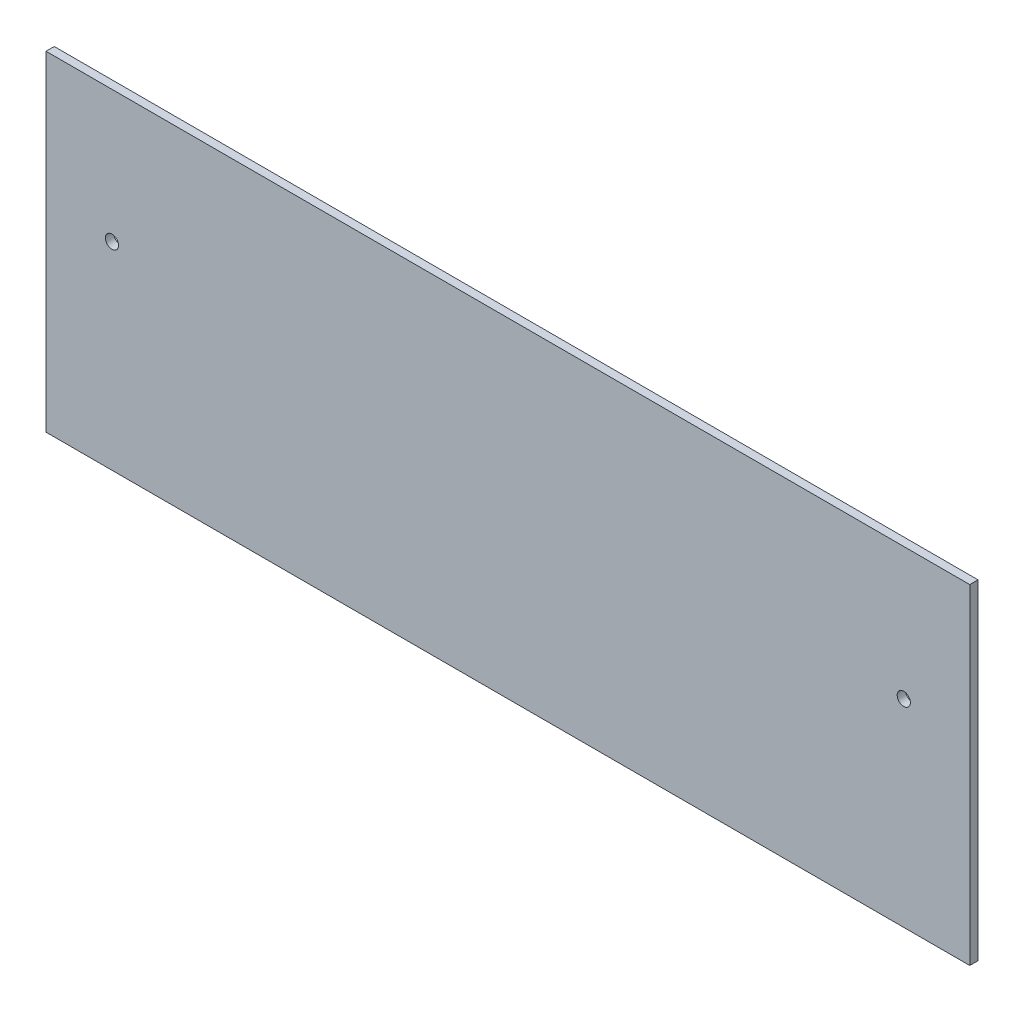
ISO-10303-21;
HEADER;
FILE_DESCRIPTION(('STEP AP214'),'2;1');
FILE_NAME('part.step','',(''),(''),'','','');
FILE_SCHEMA(('AUTOMOTIVE_DESIGN { 1 0 10303 214 1 1 1 1 }'));
ENDSEC;
DATA;
#1=APPLICATION_CONTEXT('core data for automotive mechanical design processes');
#2=APPLICATION_PROTOCOL_DEFINITION('international standard','automotive_design',2000,#1);
#3=PRODUCT_CONTEXT('',#1,'mechanical');
#4=PRODUCT('Part','Part','',(#3));
#5=PRODUCT_RELATED_PRODUCT_CATEGORY('part','',(#4));
#6=PRODUCT_DEFINITION_FORMATION('','',#4);
#7=PRODUCT_DEFINITION_CONTEXT('part definition',#1,'design');
#8=PRODUCT_DEFINITION('design','',#6,#7);
#9=PRODUCT_DEFINITION_SHAPE('','',#8);
#10=(LENGTH_UNIT() NAMED_UNIT(*) SI_UNIT(.MILLI.,.METRE.));
#11=(NAMED_UNIT(*) PLANE_ANGLE_UNIT() SI_UNIT($,.RADIAN.));
#12=(NAMED_UNIT(*) SI_UNIT($,.STERADIAN.) SOLID_ANGLE_UNIT());
#13=UNCERTAINTY_MEASURE_WITH_UNIT(LENGTH_MEASURE(1.E-05),#10,'distance_accuracy_value','');
#14=(GEOMETRIC_REPRESENTATION_CONTEXT(3) GLOBAL_UNCERTAINTY_ASSIGNED_CONTEXT((#13)) GLOBAL_UNIT_ASSIGNED_CONTEXT((#10,
#11,#12)) REPRESENTATION_CONTEXT('',''));
#15=CARTESIAN_POINT('',(0.,0.,0.));
#16=DIRECTION('',(0.,0.,1.));
#17=DIRECTION('',(1.,0.,0.));
#18=AXIS2_PLACEMENT_3D('',#15,#16,#17);
#19=CARTESIAN_POINT('',(0.,0.,2.5));
#20=DIRECTION('',(1.,0.,0.));
#21=DIRECTION('',(0.,0.,-1.));
#22=AXIS2_PLACEMENT_3D('',#19,#20,#21);
#23=PLANE('',#22);
#24=DIRECTION('',(0.,-1.,0.));
#25=VECTOR('',#24,1.);
#26=CARTESIAN_POINT('',(0.,0.,0.));
#27=LINE('',#26,#25);
#28=CARTESIAN_POINT('',(0.,100.,0.));
#29=VERTEX_POINT('',#28);
#30=CARTESIAN_POINT('',(0.,0.,0.));
#31=VERTEX_POINT('',#30);
#32=EDGE_CURVE('E100',#29,#31,#27,.T.);
#33=ORIENTED_EDGE('',*,*,#32,.T.);
#34=DIRECTION('',(0.,0.,-1.));
#35=VECTOR('',#34,1.);
#36=CARTESIAN_POINT('',(0.,0.,2.5));
#37=LINE('',#36,#35);
#38=CARTESIAN_POINT('',(0.,0.,2.5));
#39=VERTEX_POINT('',#38);
#40=EDGE_CURVE('E11',#39,#31,#37,.T.);
#41=ORIENTED_EDGE('',*,*,#40,.F.);
#42=DIRECTION('',(0.,-1.,0.));
#43=VECTOR('',#42,1.);
#44=CARTESIAN_POINT('',(0.,0.,2.5));
#45=LINE('',#44,#43);
#46=CARTESIAN_POINT('',(0.,100.,2.5));
#47=VERTEX_POINT('',#46);
#48=EDGE_CURVE('E88',#47,#39,#45,.T.);
#49=ORIENTED_EDGE('',*,*,#48,.F.);
#50=DIRECTION('',(0.,0.,-1.));
#51=VECTOR('',#50,1.);
#52=CARTESIAN_POINT('',(0.,100.,2.5));
#53=LINE('',#52,#51);
#54=EDGE_CURVE('E96',#47,#29,#53,.T.);
#55=ORIENTED_EDGE('',*,*,#54,.T.);
#56=EDGE_LOOP('',(#33,#41,#49,#55));
#57=FACE_BOUND('',#56,.T.);
#58=ADVANCED_FACE('F37',(#57),#23,.F.);
#59=CARTESIAN_POINT('',(0.,0.,2.5));
#60=DIRECTION('',(0.,1.,0.));
#61=DIRECTION('',(0.,0.,1.));
#62=AXIS2_PLACEMENT_3D('',#59,#60,#61);
#63=PLANE('',#62);
#64=DIRECTION('',(1.,0.,0.));
#65=VECTOR('',#64,1.);
#66=CARTESIAN_POINT('',(0.,0.,0.));
#67=LINE('',#66,#65);
#68=CARTESIAN_POINT('',(280.,0.,0.));
#69=VERTEX_POINT('',#68);
#70=EDGE_CURVE('E92',#31,#69,#67,.T.);
#71=ORIENTED_EDGE('',*,*,#70,.T.);
#72=DIRECTION('',(0.,0.,-1.));
#73=VECTOR('',#72,1.);
#74=CARTESIAN_POINT('',(280.,0.,2.5));
#75=LINE('',#74,#73);
#76=CARTESIAN_POINT('',(280.,0.,2.5));
#77=VERTEX_POINT('',#76);
#78=EDGE_CURVE('E45',#77,#69,#75,.T.);
#79=ORIENTED_EDGE('',*,*,#78,.F.);
#80=DIRECTION('',(1.,0.,0.));
#81=VECTOR('',#80,1.);
#82=CARTESIAN_POINT('',(0.,0.,2.5));
#83=LINE('',#82,#81);
#84=EDGE_CURVE('E83',#39,#77,#83,.T.);
#85=ORIENTED_EDGE('',*,*,#84,.F.);
#86=ORIENTED_EDGE('',*,*,#40,.T.);
#87=EDGE_LOOP('',(#71,#79,#85,#86));
#88=FACE_BOUND('',#87,.T.);
#89=ADVANCED_FACE('F91',(#88),#63,.F.);
#90=CARTESIAN_POINT('',(280.,0.,2.5));
#91=DIRECTION('',(-1.,0.,0.));
#92=DIRECTION('',(0.,0.,1.));
#93=AXIS2_PLACEMENT_3D('',#90,#91,#92);
#94=PLANE('',#93);
#95=DIRECTION('',(0.,1.,0.));
#96=VECTOR('',#95,1.);
#97=CARTESIAN_POINT('',(280.,0.,0.));
#98=LINE('',#97,#96);
#99=CARTESIAN_POINT('',(280.,100.,0.));
#100=VERTEX_POINT('',#99);
#101=EDGE_CURVE('E70',#69,#100,#98,.T.);
#102=ORIENTED_EDGE('',*,*,#101,.T.);
#103=DIRECTION('',(0.,0.,-1.));
#104=VECTOR('',#103,1.);
#105=CARTESIAN_POINT('',(280.,100.,2.5));
#106=LINE('',#105,#104);
#107=CARTESIAN_POINT('',(280.,100.,2.5));
#108=VERTEX_POINT('',#107);
#109=EDGE_CURVE('E93',#108,#100,#106,.T.);
#110=ORIENTED_EDGE('',*,*,#109,.F.);
#111=DIRECTION('',(0.,1.,0.));
#112=VECTOR('',#111,1.);
#113=CARTESIAN_POINT('',(280.,0.,2.5));
#114=LINE('',#113,#112);
#115=EDGE_CURVE('E86',#77,#108,#114,.T.);
#116=ORIENTED_EDGE('',*,*,#115,.F.);
#117=ORIENTED_EDGE('',*,*,#78,.T.);
#118=EDGE_LOOP('',(#102,#110,#116,#117));
#119=FACE_BOUND('',#118,.T.);
#120=ADVANCED_FACE('F94',(#119),#94,.F.);
#121=CARTESIAN_POINT('',(0.,100.,2.5));
#122=DIRECTION('',(0.,-1.,0.));
#123=DIRECTION('',(0.,0.,-1.));
#124=AXIS2_PLACEMENT_3D('',#121,#122,#123);
#125=PLANE('',#124);
#126=DIRECTION('',(-1.,0.,0.));
#127=VECTOR('',#126,1.);
#128=CARTESIAN_POINT('',(0.,100.,0.));
#129=LINE('',#128,#127);
#130=EDGE_CURVE('E76',#100,#29,#129,.T.);
#131=ORIENTED_EDGE('',*,*,#130,.T.);
#132=ORIENTED_EDGE('',*,*,#54,.F.);
#133=DIRECTION('',(-1.,0.,0.));
#134=VECTOR('',#133,1.);
#135=CARTESIAN_POINT('',(0.,100.,2.5));
#136=LINE('',#135,#134);
#137=EDGE_CURVE('E53',#108,#47,#136,.T.);
#138=ORIENTED_EDGE('',*,*,#137,.F.);
#139=ORIENTED_EDGE('',*,*,#109,.T.);
#140=EDGE_LOOP('',(#131,#132,#138,#139));
#141=FACE_BOUND('',#140,.T.);
#142=ADVANCED_FACE('F108',(#141),#125,.F.);
#143=CARTESIAN_POINT('',(0.,0.,2.5));
#144=DIRECTION('',(0.,0.,-1.));
#145=DIRECTION('',(-1.,0.,0.));
#146=AXIS2_PLACEMENT_3D('',#143,#144,#145);
#147=PLANE('',#146);
#148=CARTESIAN_POINT('',(20.,60.,2.5));
#149=DIRECTION('',(0.,0.,-1.));
#150=DIRECTION('',(-1.,0.,0.));
#151=AXIS2_PLACEMENT_3D('',#148,#149,#150);
#152=CIRCLE('',#151,2.);
#153=CARTESIAN_POINT('',(18.,60.,2.5));
#154=VERTEX_POINT('',#153);
#155=EDGE_CURVE('E103',#154,#154,#152,.T.);
#156=ORIENTED_EDGE('',*,*,#155,.T.);
#157=EDGE_LOOP('',(#156));
#158=FACE_BOUND('',#157,.T.);
#159=CARTESIAN_POINT('',(260.,60.,2.5));
#160=DIRECTION('',(0.,0.,-1.));
#161=DIRECTION('',(-1.,0.,0.));
#162=AXIS2_PLACEMENT_3D('',#159,#160,#161);
#163=CIRCLE('',#162,2.);
#164=CARTESIAN_POINT('',(258.,60.,2.5));
#165=VERTEX_POINT('',#164);
#166=EDGE_CURVE('E116',#165,#165,#163,.T.);
#167=ORIENTED_EDGE('',*,*,#166,.T.);
#168=EDGE_LOOP('',(#167));
#169=FACE_BOUND('',#168,.T.);
#170=ORIENTED_EDGE('',*,*,#48,.T.);
#171=ORIENTED_EDGE('',*,*,#84,.T.);
#172=ORIENTED_EDGE('',*,*,#115,.T.);
#173=ORIENTED_EDGE('',*,*,#137,.T.);
#174=EDGE_LOOP('',(#170,#171,#172,#173));
#175=FACE_BOUND('',#174,.T.);
#176=ADVANCED_FACE('F84',(#158,#169,#175),#147,.F.);
#177=CARTESIAN_POINT('',(0.,0.,0.));
#178=DIRECTION('',(0.,0.,-1.));
#179=DIRECTION('',(-1.,0.,0.));
#180=AXIS2_PLACEMENT_3D('',#177,#178,#179);
#181=PLANE('',#180);
#182=CARTESIAN_POINT('',(20.,60.,0.));
#183=DIRECTION('',(0.,0.,-1.));
#184=DIRECTION('',(-1.,0.,0.));
#185=AXIS2_PLACEMENT_3D('',#182,#183,#184);
#186=CIRCLE('',#185,2.);
#187=CARTESIAN_POINT('',(18.,60.,0.));
#188=VERTEX_POINT('',#187);
#189=EDGE_CURVE('E119',#188,#188,#186,.T.);
#190=ORIENTED_EDGE('',*,*,#189,.F.);
#191=EDGE_LOOP('',(#190));
#192=FACE_BOUND('',#191,.T.);
#193=CARTESIAN_POINT('',(260.,60.,0.));
#194=DIRECTION('',(0.,0.,-1.));
#195=DIRECTION('',(-1.,0.,0.));
#196=AXIS2_PLACEMENT_3D('',#193,#194,#195);
#197=CIRCLE('',#196,2.);
#198=CARTESIAN_POINT('',(258.,60.,0.));
#199=VERTEX_POINT('',#198);
#200=EDGE_CURVE('E120',#199,#199,#197,.T.);
#201=ORIENTED_EDGE('',*,*,#200,.F.);
#202=EDGE_LOOP('',(#201));
#203=FACE_BOUND('',#202,.T.);
#204=ORIENTED_EDGE('',*,*,#32,.F.);
#205=ORIENTED_EDGE('',*,*,#130,.F.);
#206=ORIENTED_EDGE('',*,*,#101,.F.);
#207=ORIENTED_EDGE('',*,*,#70,.F.);
#208=EDGE_LOOP('',(#204,#205,#206,#207));
#209=FACE_BOUND('',#208,.T.);
#210=ADVANCED_FACE('F111',(#192,#203,#209),#181,.T.);
#211=CARTESIAN_POINT('',(260.,60.,10.));
#212=DIRECTION('',(0.,0.,-1.));
#213=DIRECTION('',(-1.,0.,0.));
#214=AXIS2_PLACEMENT_3D('',#211,#212,#213);
#215=CYLINDRICAL_SURFACE('',#214,2.);
#216=ORIENTED_EDGE('',*,*,#200,.T.);
#217=EDGE_LOOP('',(#216));
#218=FACE_BOUND('',#217,.T.);
#219=ORIENTED_EDGE('',*,*,#166,.F.);
#220=EDGE_LOOP('',(#219));
#221=FACE_BOUND('',#220,.T.);
#222=ADVANCED_FACE('F131',(#218,#221),#215,.F.);
#223=CARTESIAN_POINT('',(20.,60.,10.));
#224=DIRECTION('',(0.,0.,-1.));
#225=DIRECTION('',(-1.,0.,0.));
#226=AXIS2_PLACEMENT_3D('',#223,#224,#225);
#227=CYLINDRICAL_SURFACE('',#226,2.);
#228=ORIENTED_EDGE('',*,*,#189,.T.);
#229=EDGE_LOOP('',(#228));
#230=FACE_BOUND('',#229,.T.);
#231=ORIENTED_EDGE('',*,*,#155,.F.);
#232=EDGE_LOOP('',(#231));
#233=FACE_BOUND('',#232,.T.);
#234=ADVANCED_FACE('F126',(#230,#233),#227,.F.);
#235=CLOSED_SHELL('',(#58,#89,#120,#142,#176,#210,#222,#234));
#236=MANIFOLD_SOLID_BREP('B2',#235);
#237=ADVANCED_BREP_SHAPE_REPRESENTATION('',(#18,#236),#14);
#238=SHAPE_DEFINITION_REPRESENTATION(#9,#237);
ENDSEC;
END-ISO-10303-21;
